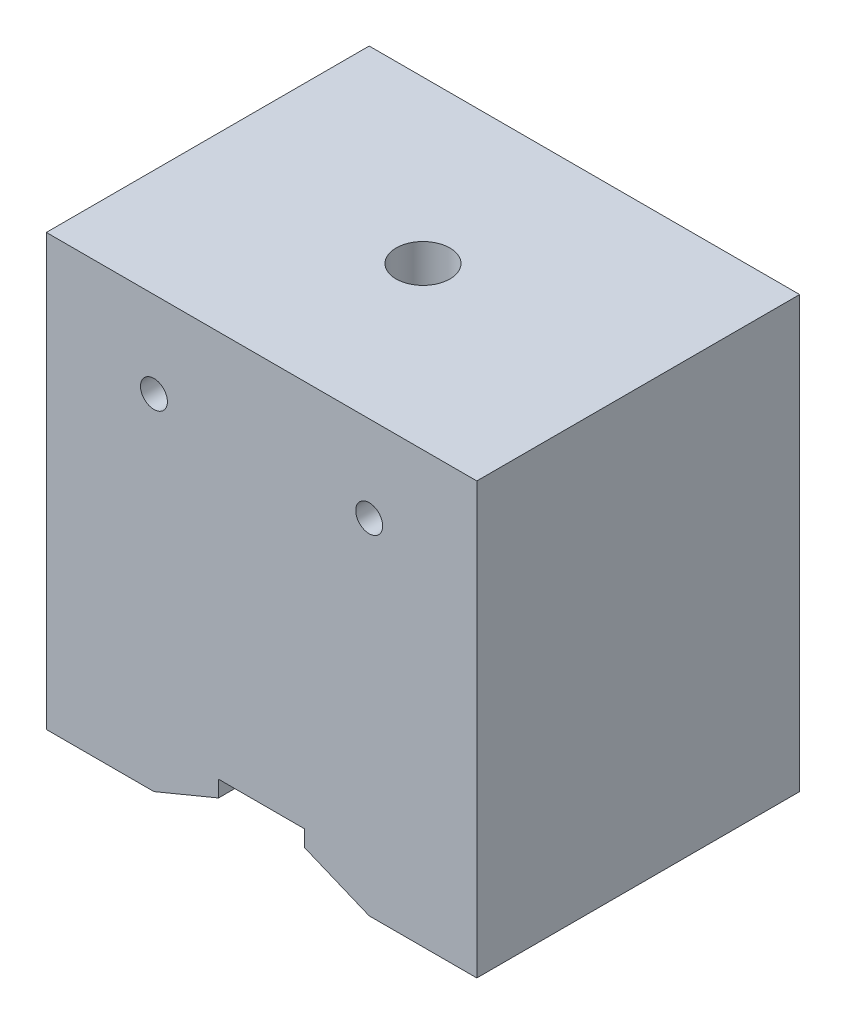
ISO-10303-21;
HEADER;
FILE_DESCRIPTION(('STEP AP214'),'2;1');
FILE_NAME('part.step','',(''),(''),'','','');
FILE_SCHEMA(('AUTOMOTIVE_DESIGN { 1 0 10303 214 1 1 1 1 }'));
ENDSEC;
DATA;
#1=APPLICATION_CONTEXT('core data for automotive mechanical design processes');
#2=APPLICATION_PROTOCOL_DEFINITION('international standard','automotive_design',2000,#1);
#3=PRODUCT_CONTEXT('',#1,'mechanical');
#4=PRODUCT('Part','Part','',(#3));
#5=PRODUCT_RELATED_PRODUCT_CATEGORY('part','',(#4));
#6=PRODUCT_DEFINITION_FORMATION('','',#4);
#7=PRODUCT_DEFINITION_CONTEXT('part definition',#1,'design');
#8=PRODUCT_DEFINITION('design','',#6,#7);
#9=PRODUCT_DEFINITION_SHAPE('','',#8);
#10=(LENGTH_UNIT() NAMED_UNIT(*) SI_UNIT(.MILLI.,.METRE.));
#11=(NAMED_UNIT(*) PLANE_ANGLE_UNIT() SI_UNIT($,.RADIAN.));
#12=(NAMED_UNIT(*) SI_UNIT($,.STERADIAN.) SOLID_ANGLE_UNIT());
#13=UNCERTAINTY_MEASURE_WITH_UNIT(LENGTH_MEASURE(1.E-05),#10,'distance_accuracy_value','');
#14=(GEOMETRIC_REPRESENTATION_CONTEXT(3) GLOBAL_UNCERTAINTY_ASSIGNED_CONTEXT((#13)) GLOBAL_UNIT_ASSIGNED_CONTEXT((#10,
#11,#12)) REPRESENTATION_CONTEXT('',''));
#15=CARTESIAN_POINT('',(0.,0.,0.));
#16=DIRECTION('',(0.,0.,1.));
#17=DIRECTION('',(1.,0.,0.));
#18=AXIS2_PLACEMENT_3D('',#15,#16,#17);
#19=CARTESIAN_POINT('',(0.,0.,30.));
#20=DIRECTION('',(0.,1.,0.));
#21=DIRECTION('',(0.,0.,1.));
#22=AXIS2_PLACEMENT_3D('',#19,#20,#21);
#23=PLANE('',#22);
#24=DIRECTION('',(1.,0.,0.));
#25=VECTOR('',#24,1.);
#26=CARTESIAN_POINT('',(0.,0.,0.));
#27=LINE('',#26,#25);
#28=CARTESIAN_POINT('',(0.,0.,0.));
#29=VERTEX_POINT('',#28);
#30=CARTESIAN_POINT('',(10.,0.,0.));
#31=VERTEX_POINT('',#30);
#32=EDGE_CURVE('E213',#29,#31,#27,.T.);
#33=ORIENTED_EDGE('',*,*,#32,.T.);
#34=DIRECTION('',(0.,0.,1.));
#35=VECTOR('',#34,1.);
#36=CARTESIAN_POINT('',(10.,0.,0.));
#37=LINE('',#36,#35);
#38=CARTESIAN_POINT('',(10.,0.,30.));
#39=VERTEX_POINT('',#38);
#40=EDGE_CURVE('E190',#31,#39,#37,.T.);
#41=ORIENTED_EDGE('',*,*,#40,.T.);
#42=DIRECTION('',(1.,0.,0.));
#43=VECTOR('',#42,1.);
#44=CARTESIAN_POINT('',(0.,0.,30.));
#45=LINE('',#44,#43);
#46=CARTESIAN_POINT('',(0.,0.,30.));
#47=VERTEX_POINT('',#46);
#48=EDGE_CURVE('E93',#47,#39,#45,.T.);
#49=ORIENTED_EDGE('',*,*,#48,.F.);
#50=DIRECTION('',(0.,0.,-1.));
#51=VECTOR('',#50,1.);
#52=CARTESIAN_POINT('',(0.,0.,30.));
#53=LINE('',#52,#51);
#54=EDGE_CURVE('E11',#47,#29,#53,.T.);
#55=ORIENTED_EDGE('',*,*,#54,.T.);
#56=EDGE_LOOP('',(#33,#41,#49,#55));
#57=FACE_BOUND('',#56,.T.);
#58=ADVANCED_FACE('F41',(#57),#23,.F.);
#59=CARTESIAN_POINT('',(0.,0.,30.));
#60=DIRECTION('',(1.,0.,0.));
#61=DIRECTION('',(0.,0.,-1.));
#62=AXIS2_PLACEMENT_3D('',#59,#60,#61);
#63=PLANE('',#62);
#64=DIRECTION('',(0.,-1.,0.));
#65=VECTOR('',#64,1.);
#66=CARTESIAN_POINT('',(0.,0.,0.));
#67=LINE('',#66,#65);
#68=CARTESIAN_POINT('',(0.,40.,0.));
#69=VERTEX_POINT('',#68);
#70=EDGE_CURVE('E192',#69,#29,#67,.T.);
#71=ORIENTED_EDGE('',*,*,#70,.T.);
#72=ORIENTED_EDGE('',*,*,#54,.F.);
#73=DIRECTION('',(0.,-1.,0.));
#74=VECTOR('',#73,1.);
#75=CARTESIAN_POINT('',(0.,0.,30.));
#76=LINE('',#75,#74);
#77=CARTESIAN_POINT('',(0.,40.,30.));
#78=VERTEX_POINT('',#77);
#79=EDGE_CURVE('E202',#78,#47,#76,.T.);
#80=ORIENTED_EDGE('',*,*,#79,.F.);
#81=DIRECTION('',(0.,0.,-1.));
#82=VECTOR('',#81,1.);
#83=CARTESIAN_POINT('',(0.,40.,30.));
#84=LINE('',#83,#82);
#85=EDGE_CURVE('E209',#78,#69,#84,.T.);
#86=ORIENTED_EDGE('',*,*,#85,.T.);
#87=EDGE_LOOP('',(#71,#72,#80,#86));
#88=FACE_BOUND('',#87,.T.);
#89=ADVANCED_FACE('F43',(#88),#63,.F.);
#90=CARTESIAN_POINT('',(30.,0.,30.));
#91=VERTEX_POINT('',#90);
#92=CARTESIAN_POINT('',(40.,0.,30.));
#93=VERTEX_POINT('',#92);
#94=EDGE_CURVE('E204',#91,#93,#45,.T.);
#95=ORIENTED_EDGE('',*,*,#94,.F.);
#96=DIRECTION('',(0.,0.,1.));
#97=VECTOR('',#96,1.);
#98=CARTESIAN_POINT('',(30.,0.,0.));
#99=LINE('',#98,#97);
#100=CARTESIAN_POINT('',(30.,0.,0.));
#101=VERTEX_POINT('',#100);
#102=EDGE_CURVE('E177',#101,#91,#99,.T.);
#103=ORIENTED_EDGE('',*,*,#102,.F.);
#104=CARTESIAN_POINT('',(40.,0.,0.));
#105=VERTEX_POINT('',#104);
#106=EDGE_CURVE('E212',#101,#105,#27,.T.);
#107=ORIENTED_EDGE('',*,*,#106,.T.);
#108=DIRECTION('',(0.,0.,-1.));
#109=VECTOR('',#108,1.);
#110=CARTESIAN_POINT('',(40.,0.,30.));
#111=LINE('',#110,#109);
#112=EDGE_CURVE('E49',#93,#105,#111,.T.);
#113=ORIENTED_EDGE('',*,*,#112,.F.);
#114=EDGE_LOOP('',(#95,#103,#107,#113));
#115=FACE_BOUND('',#114,.T.);
#116=ADVANCED_FACE('F248',(#115),#23,.F.);
#117=CARTESIAN_POINT('',(40.,0.,30.));
#118=DIRECTION('',(-1.,0.,0.));
#119=DIRECTION('',(0.,0.,1.));
#120=AXIS2_PLACEMENT_3D('',#117,#118,#119);
#121=PLANE('',#120);
#122=DIRECTION('',(0.,1.,0.));
#123=VECTOR('',#122,1.);
#124=CARTESIAN_POINT('',(40.,0.,0.));
#125=LINE('',#124,#123);
#126=CARTESIAN_POINT('',(40.,40.,0.));
#127=VERTEX_POINT('',#126);
#128=EDGE_CURVE('E216',#105,#127,#125,.T.);
#129=ORIENTED_EDGE('',*,*,#128,.T.);
#130=DIRECTION('',(0.,0.,-1.));
#131=VECTOR('',#130,1.);
#132=CARTESIAN_POINT('',(40.,40.,30.));
#133=LINE('',#132,#131);
#134=CARTESIAN_POINT('',(40.,40.,30.));
#135=VERTEX_POINT('',#134);
#136=EDGE_CURVE('E220',#135,#127,#133,.T.);
#137=ORIENTED_EDGE('',*,*,#136,.F.);
#138=DIRECTION('',(0.,1.,0.));
#139=VECTOR('',#138,1.);
#140=CARTESIAN_POINT('',(40.,0.,30.));
#141=LINE('',#140,#139);
#142=EDGE_CURVE('E206',#93,#135,#141,.T.);
#143=ORIENTED_EDGE('',*,*,#142,.F.);
#144=ORIENTED_EDGE('',*,*,#112,.T.);
#145=EDGE_LOOP('',(#129,#137,#143,#144));
#146=FACE_BOUND('',#145,.T.);
#147=ADVANCED_FACE('F226',(#146),#121,.F.);
#148=CARTESIAN_POINT('',(0.,40.,30.));
#149=DIRECTION('',(0.,-1.,0.));
#150=DIRECTION('',(0.,0.,-1.));
#151=AXIS2_PLACEMENT_3D('',#148,#149,#150);
#152=PLANE('',#151);
#153=CARTESIAN_POINT('',(20.,40.,15.));
#154=DIRECTION('',(0.,1.,0.));
#155=DIRECTION('',(0.,0.,1.));
#156=AXIS2_PLACEMENT_3D('',#153,#154,#155);
#157=CIRCLE('',#156,2.5);
#158=CARTESIAN_POINT('',(20.,40.,17.5));
#159=VERTEX_POINT('',#158);
#160=EDGE_CURVE('E156',#159,#159,#157,.T.);
#161=ORIENTED_EDGE('',*,*,#160,.F.);
#162=EDGE_LOOP('',(#161));
#163=FACE_BOUND('',#162,.T.);
#164=DIRECTION('',(-1.,0.,0.));
#165=VECTOR('',#164,1.);
#166=CARTESIAN_POINT('',(0.,40.,0.));
#167=LINE('',#166,#165);
#168=EDGE_CURVE('E86',#127,#69,#167,.T.);
#169=ORIENTED_EDGE('',*,*,#168,.T.);
#170=ORIENTED_EDGE('',*,*,#85,.F.);
#171=DIRECTION('',(-1.,0.,0.));
#172=VECTOR('',#171,1.);
#173=CARTESIAN_POINT('',(0.,40.,30.));
#174=LINE('',#173,#172);
#175=EDGE_CURVE('E65',#135,#78,#174,.T.);
#176=ORIENTED_EDGE('',*,*,#175,.F.);
#177=ORIENTED_EDGE('',*,*,#136,.T.);
#178=EDGE_LOOP('',(#169,#170,#176,#177));
#179=FACE_BOUND('',#178,.T.);
#180=ADVANCED_FACE('F237',(#163,#179),#152,.F.);
#181=CARTESIAN_POINT('',(0.,0.,30.));
#182=DIRECTION('',(0.,0.,-1.));
#183=DIRECTION('',(-1.,0.,0.));
#184=AXIS2_PLACEMENT_3D('',#181,#182,#183);
#185=PLANE('',#184);
#186=CARTESIAN_POINT('',(10.,32.,30.));
#187=DIRECTION('',(0.,0.,1.));
#188=DIRECTION('',(1.,0.,0.));
#189=AXIS2_PLACEMENT_3D('',#186,#187,#188);
#190=CIRCLE('',#189,1.25);
#191=CARTESIAN_POINT('',(11.25,32.,30.));
#192=VERTEX_POINT('',#191);
#193=EDGE_CURVE('E146',#192,#192,#190,.T.);
#194=ORIENTED_EDGE('',*,*,#193,.F.);
#195=EDGE_LOOP('',(#194));
#196=FACE_BOUND('',#195,.T.);
#197=CARTESIAN_POINT('',(30.,32.,30.));
#198=DIRECTION('',(0.,0.,1.));
#199=DIRECTION('',(1.,0.,0.));
#200=AXIS2_PLACEMENT_3D('',#197,#198,#199);
#201=CIRCLE('',#200,1.25);
#202=CARTESIAN_POINT('',(31.25,32.,30.));
#203=VERTEX_POINT('',#202);
#204=EDGE_CURVE('E145',#203,#203,#201,.T.);
#205=ORIENTED_EDGE('',*,*,#204,.F.);
#206=EDGE_LOOP('',(#205));
#207=FACE_BOUND('',#206,.T.);
#208=ORIENTED_EDGE('',*,*,#48,.T.);
#209=DIRECTION('',(-0.923879532511287,-0.38268343236509,0.));
#210=VECTOR('',#209,1.);
#211=CARTESIAN_POINT('',(10.,0.,30.));
#212=LINE('',#211,#210);
#213=CARTESIAN_POINT('',(16.,2.48528137423858,30.));
#214=VERTEX_POINT('',#213);
#215=EDGE_CURVE('E166',#214,#39,#212,.T.);
#216=ORIENTED_EDGE('',*,*,#215,.F.);
#217=DIRECTION('',(0.,-1.,0.));
#218=VECTOR('',#217,1.);
#219=CARTESIAN_POINT('',(16.,2.48528137423858,30.));
#220=LINE('',#219,#218);
#221=CARTESIAN_POINT('',(16.,4.,30.));
#222=VERTEX_POINT('',#221);
#223=EDGE_CURVE('E186',#222,#214,#220,.T.);
#224=ORIENTED_EDGE('',*,*,#223,.F.);
#225=DIRECTION('',(-1.,0.,0.));
#226=VECTOR('',#225,1.);
#227=CARTESIAN_POINT('',(16.,4.,30.));
#228=LINE('',#227,#226);
#229=CARTESIAN_POINT('',(24.,4.,30.));
#230=VERTEX_POINT('',#229);
#231=EDGE_CURVE('E183',#230,#222,#228,.T.);
#232=ORIENTED_EDGE('',*,*,#231,.F.);
#233=DIRECTION('',(0.,1.,0.));
#234=VECTOR('',#233,1.);
#235=CARTESIAN_POINT('',(24.,4.,30.));
#236=LINE('',#235,#234);
#237=CARTESIAN_POINT('',(24.,2.48528137423858,30.));
#238=VERTEX_POINT('',#237);
#239=EDGE_CURVE('E180',#238,#230,#236,.T.);
#240=ORIENTED_EDGE('',*,*,#239,.F.);
#241=DIRECTION('',(-0.923879532511287,0.38268343236509,0.));
#242=VECTOR('',#241,1.);
#243=CARTESIAN_POINT('',(24.,2.48528137423858,30.));
#244=LINE('',#243,#242);
#245=EDGE_CURVE('E162',#91,#238,#244,.T.);
#246=ORIENTED_EDGE('',*,*,#245,.F.);
#247=ORIENTED_EDGE('',*,*,#94,.T.);
#248=ORIENTED_EDGE('',*,*,#142,.T.);
#249=ORIENTED_EDGE('',*,*,#175,.T.);
#250=ORIENTED_EDGE('',*,*,#79,.T.);
#251=EDGE_LOOP('',(#208,#216,#224,#232,#240,#246,#247,#248,#249,#250));
#252=FACE_BOUND('',#251,.T.);
#253=ADVANCED_FACE('F239',(#196,#207,#252),#185,.F.);
#254=CARTESIAN_POINT('',(0.,0.,0.));
#255=DIRECTION('',(0.,0.,-1.));
#256=DIRECTION('',(-1.,0.,0.));
#257=AXIS2_PLACEMENT_3D('',#254,#255,#256);
#258=PLANE('',#257);
#259=DIRECTION('',(-0.923879532511287,-0.38268343236509,0.));
#260=VECTOR('',#259,1.);
#261=CARTESIAN_POINT('',(10.,0.,0.));
#262=LINE('',#261,#260);
#263=CARTESIAN_POINT('',(16.,2.48528137423858,0.));
#264=VERTEX_POINT('',#263);
#265=EDGE_CURVE('E174',#264,#31,#262,.T.);
#266=ORIENTED_EDGE('',*,*,#265,.T.);
#267=ORIENTED_EDGE('',*,*,#32,.F.);
#268=ORIENTED_EDGE('',*,*,#70,.F.);
#269=ORIENTED_EDGE('',*,*,#168,.F.);
#270=ORIENTED_EDGE('',*,*,#128,.F.);
#271=ORIENTED_EDGE('',*,*,#106,.F.);
#272=DIRECTION('',(-0.923879532511287,0.38268343236509,0.));
#273=VECTOR('',#272,1.);
#274=CARTESIAN_POINT('',(24.,2.48528137423858,0.));
#275=LINE('',#274,#273);
#276=CARTESIAN_POINT('',(24.,2.48528137423857,0.));
#277=VERTEX_POINT('',#276);
#278=EDGE_CURVE('E163',#101,#277,#275,.T.);
#279=ORIENTED_EDGE('',*,*,#278,.T.);
#280=DIRECTION('',(0.,1.,0.));
#281=VECTOR('',#280,1.);
#282=CARTESIAN_POINT('',(24.,4.,0.));
#283=LINE('',#282,#281);
#284=CARTESIAN_POINT('',(24.,4.,0.));
#285=VERTEX_POINT('',#284);
#286=EDGE_CURVE('E56',#277,#285,#283,.T.);
#287=ORIENTED_EDGE('',*,*,#286,.T.);
#288=DIRECTION('',(-1.,0.,0.));
#289=VECTOR('',#288,1.);
#290=CARTESIAN_POINT('',(16.,4.,0.));
#291=LINE('',#290,#289);
#292=CARTESIAN_POINT('',(16.,4.,0.));
#293=VERTEX_POINT('',#292);
#294=EDGE_CURVE('E168',#285,#293,#291,.T.);
#295=ORIENTED_EDGE('',*,*,#294,.T.);
#296=DIRECTION('',(0.,-1.,0.));
#297=VECTOR('',#296,1.);
#298=CARTESIAN_POINT('',(16.,2.48528137423858,0.));
#299=LINE('',#298,#297);
#300=EDGE_CURVE('E171',#293,#264,#299,.T.);
#301=ORIENTED_EDGE('',*,*,#300,.T.);
#302=EDGE_LOOP('',(#266,#267,#268,#269,#270,#271,#279,#287,#295,#301));
#303=FACE_BOUND('',#302,.T.);
#304=ADVANCED_FACE('F232',(#303),#258,.T.);
#305=CARTESIAN_POINT('',(10.,0.,0.));
#306=DIRECTION('',(-0.38268343236509,0.923879532511287,0.));
#307=DIRECTION('',(-0.923879532511287,-0.38268343236509,0.));
#308=AXIS2_PLACEMENT_3D('',#305,#306,#307);
#309=PLANE('',#308);
#310=ORIENTED_EDGE('',*,*,#215,.T.);
#311=ORIENTED_EDGE('',*,*,#40,.F.);
#312=ORIENTED_EDGE('',*,*,#265,.F.);
#313=DIRECTION('',(0.,0.,1.));
#314=VECTOR('',#313,1.);
#315=CARTESIAN_POINT('',(16.,2.48528137423858,0.));
#316=LINE('',#315,#314);
#317=EDGE_CURVE('E193',#264,#214,#316,.T.);
#318=ORIENTED_EDGE('',*,*,#317,.T.);
#319=EDGE_LOOP('',(#310,#311,#312,#318));
#320=FACE_BOUND('',#319,.T.);
#321=ADVANCED_FACE('F275',(#320),#309,.F.);
#322=CARTESIAN_POINT('',(16.,2.48528137423858,0.));
#323=DIRECTION('',(-1.,0.,0.));
#324=DIRECTION('',(0.,0.,1.));
#325=AXIS2_PLACEMENT_3D('',#322,#323,#324);
#326=PLANE('',#325);
#327=ORIENTED_EDGE('',*,*,#223,.T.);
#328=ORIENTED_EDGE('',*,*,#317,.F.);
#329=ORIENTED_EDGE('',*,*,#300,.F.);
#330=DIRECTION('',(0.,0.,1.));
#331=VECTOR('',#330,1.);
#332=CARTESIAN_POINT('',(16.,4.,0.));
#333=LINE('',#332,#331);
#334=EDGE_CURVE('E195',#293,#222,#333,.T.);
#335=ORIENTED_EDGE('',*,*,#334,.T.);
#336=EDGE_LOOP('',(#327,#328,#329,#335));
#337=FACE_BOUND('',#336,.T.);
#338=ADVANCED_FACE('F271',(#337),#326,.F.);
#339=CARTESIAN_POINT('',(16.,4.,0.));
#340=DIRECTION('',(0.,1.,0.));
#341=DIRECTION('',(-1.,0.,0.));
#342=AXIS2_PLACEMENT_3D('',#339,#340,#341);
#343=PLANE('',#342);
#344=ORIENTED_EDGE('',*,*,#231,.T.);
#345=ORIENTED_EDGE('',*,*,#334,.F.);
#346=ORIENTED_EDGE('',*,*,#294,.F.);
#347=DIRECTION('',(0.,0.,1.));
#348=VECTOR('',#347,1.);
#349=CARTESIAN_POINT('',(24.,4.,0.));
#350=LINE('',#349,#348);
#351=EDGE_CURVE('E197',#285,#230,#350,.T.);
#352=ORIENTED_EDGE('',*,*,#351,.T.);
#353=EDGE_LOOP('',(#344,#345,#346,#352));
#354=FACE_BOUND('',#353,.T.);
#355=ADVANCED_FACE('F268',(#354),#343,.F.);
#356=CARTESIAN_POINT('',(24.,4.,0.));
#357=DIRECTION('',(1.,0.,0.));
#358=DIRECTION('',(0.,0.,-1.));
#359=AXIS2_PLACEMENT_3D('',#356,#357,#358);
#360=PLANE('',#359);
#361=ORIENTED_EDGE('',*,*,#239,.T.);
#362=ORIENTED_EDGE('',*,*,#351,.F.);
#363=ORIENTED_EDGE('',*,*,#286,.F.);
#364=DIRECTION('',(0.,0.,1.));
#365=VECTOR('',#364,1.);
#366=CARTESIAN_POINT('',(24.,2.48528137423858,0.));
#367=LINE('',#366,#365);
#368=EDGE_CURVE('E199',#277,#238,#367,.T.);
#369=ORIENTED_EDGE('',*,*,#368,.T.);
#370=EDGE_LOOP('',(#361,#362,#363,#369));
#371=FACE_BOUND('',#370,.T.);
#372=ADVANCED_FACE('F289',(#371),#360,.F.);
#373=CARTESIAN_POINT('',(24.,2.48528137423858,0.));
#374=DIRECTION('',(0.38268343236509,0.923879532511287,0.));
#375=DIRECTION('',(-0.923879532511287,0.38268343236509,0.));
#376=AXIS2_PLACEMENT_3D('',#373,#374,#375);
#377=PLANE('',#376);
#378=ORIENTED_EDGE('',*,*,#245,.T.);
#379=ORIENTED_EDGE('',*,*,#368,.F.);
#380=ORIENTED_EDGE('',*,*,#278,.F.);
#381=ORIENTED_EDGE('',*,*,#102,.T.);
#382=EDGE_LOOP('',(#378,#379,#380,#381));
#383=FACE_BOUND('',#382,.T.);
#384=ADVANCED_FACE('F264',(#383),#377,.F.);
#385=CARTESIAN_POINT('',(20.,25.,15.));
#386=DIRECTION('',(0.,1.,0.));
#387=DIRECTION('',(0.,0.,1.));
#388=AXIS2_PLACEMENT_3D('',#385,#386,#387);
#389=CONICAL_SURFACE('',#388,2.5,1.02974425867665);
#390=CARTESIAN_POINT('',(20.,23.4978484524311,15.));
#391=VERTEX_POINT('',#390);
#392=VERTEX_LOOP('',#391);
#393=FACE_BOUND('',#392,.T.);
#394=CARTESIAN_POINT('',(20.,25.,15.));
#395=DIRECTION('',(0.,1.,0.));
#396=DIRECTION('',(0.,0.,1.));
#397=AXIS2_PLACEMENT_3D('',#394,#395,#396);
#398=CIRCLE('',#397,2.5);
#399=CARTESIAN_POINT('',(20.,25.,17.5));
#400=VERTEX_POINT('',#399);
#401=EDGE_CURVE('E159',#400,#400,#398,.T.);
#402=ORIENTED_EDGE('',*,*,#401,.T.);
#403=EDGE_LOOP('',(#402));
#404=FACE_BOUND('',#403,.T.);
#405=ADVANCED_FACE('F284',(#393,#404),#389,.F.);
#406=CARTESIAN_POINT('',(20.,40.,15.));
#407=DIRECTION('',(0.,1.,0.));
#408=DIRECTION('',(0.,0.,1.));
#409=AXIS2_PLACEMENT_3D('',#406,#407,#408);
#410=CYLINDRICAL_SURFACE('',#409,2.5);
#411=ORIENTED_EDGE('',*,*,#401,.F.);
#412=EDGE_LOOP('',(#411));
#413=FACE_BOUND('',#412,.T.);
#414=ORIENTED_EDGE('',*,*,#160,.T.);
#415=EDGE_LOOP('',(#414));
#416=FACE_BOUND('',#415,.T.);
#417=ADVANCED_FACE('F296',(#413,#416),#410,.F.);
#418=CARTESIAN_POINT('',(30.,32.,22.5));
#419=DIRECTION('',(0.,0.,1.));
#420=DIRECTION('',(1.,0.,0.));
#421=AXIS2_PLACEMENT_3D('',#418,#419,#420);
#422=CONICAL_SURFACE('',#421,1.25,1.02974425867665);
#423=CARTESIAN_POINT('',(30.,32.,21.7489242262155));
#424=VERTEX_POINT('',#423);
#425=VERTEX_LOOP('',#424);
#426=FACE_BOUND('',#425,.T.);
#427=CARTESIAN_POINT('',(30.,32.,22.5));
#428=DIRECTION('',(0.,0.,1.));
#429=DIRECTION('',(1.,0.,0.));
#430=AXIS2_PLACEMENT_3D('',#427,#428,#429);
#431=CIRCLE('',#430,1.25);
#432=CARTESIAN_POINT('',(31.25,32.,22.5));
#433=VERTEX_POINT('',#432);
#434=EDGE_CURVE('E149',#433,#433,#431,.T.);
#435=ORIENTED_EDGE('',*,*,#434,.T.);
#436=EDGE_LOOP('',(#435));
#437=FACE_BOUND('',#436,.T.);
#438=ADVANCED_FACE('F301',(#426,#437),#422,.F.);
#439=CARTESIAN_POINT('',(30.,32.,30.));
#440=DIRECTION('',(0.,0.,1.));
#441=DIRECTION('',(1.,0.,0.));
#442=AXIS2_PLACEMENT_3D('',#439,#440,#441);
#443=CYLINDRICAL_SURFACE('',#442,1.25);
#444=ORIENTED_EDGE('',*,*,#434,.F.);
#445=EDGE_LOOP('',(#444));
#446=FACE_BOUND('',#445,.T.);
#447=ORIENTED_EDGE('',*,*,#204,.T.);
#448=EDGE_LOOP('',(#447));
#449=FACE_BOUND('',#448,.T.);
#450=ADVANCED_FACE('F139',(#446,#449),#443,.F.);
#451=CARTESIAN_POINT('',(10.,32.,22.5));
#452=DIRECTION('',(0.,0.,1.));
#453=DIRECTION('',(1.,0.,0.));
#454=AXIS2_PLACEMENT_3D('',#451,#452,#453);
#455=CONICAL_SURFACE('',#454,1.25,1.02974425867665);
#456=CARTESIAN_POINT('',(10.,32.,21.7489242262155));
#457=VERTEX_POINT('',#456);
#458=VERTEX_LOOP('',#457);
#459=FACE_BOUND('',#458,.T.);
#460=CARTESIAN_POINT('',(10.,32.,22.5));
#461=DIRECTION('',(0.,0.,1.));
#462=DIRECTION('',(1.,0.,0.));
#463=AXIS2_PLACEMENT_3D('',#460,#461,#462);
#464=CIRCLE('',#463,1.25);
#465=CARTESIAN_POINT('',(11.25,32.,22.5));
#466=VERTEX_POINT('',#465);
#467=EDGE_CURVE('E143',#466,#466,#464,.T.);
#468=ORIENTED_EDGE('',*,*,#467,.T.);
#469=EDGE_LOOP('',(#468));
#470=FACE_BOUND('',#469,.T.);
#471=ADVANCED_FACE('F135',(#459,#470),#455,.F.);
#472=CARTESIAN_POINT('',(10.,32.,30.));
#473=DIRECTION('',(0.,0.,1.));
#474=DIRECTION('',(1.,0.,0.));
#475=AXIS2_PLACEMENT_3D('',#472,#473,#474);
#476=CYLINDRICAL_SURFACE('',#475,1.25);
#477=ORIENTED_EDGE('',*,*,#467,.F.);
#478=EDGE_LOOP('',(#477));
#479=FACE_BOUND('',#478,.T.);
#480=ORIENTED_EDGE('',*,*,#193,.T.);
#481=EDGE_LOOP('',(#480));
#482=FACE_BOUND('',#481,.T.);
#483=ADVANCED_FACE('F138',(#479,#482),#476,.F.);
#484=CLOSED_SHELL('',(#58,#89,#116,#147,#180,#253,#304,#321,#338,#355,#372,#384,#405,#417,#438,
#450,#471,#483));
#485=MANIFOLD_SOLID_BREP('B2',#484);
#486=ADVANCED_BREP_SHAPE_REPRESENTATION('',(#18,#485),#14);
#487=SHAPE_DEFINITION_REPRESENTATION(#9,#486);
ENDSEC;
END-ISO-10303-21;
